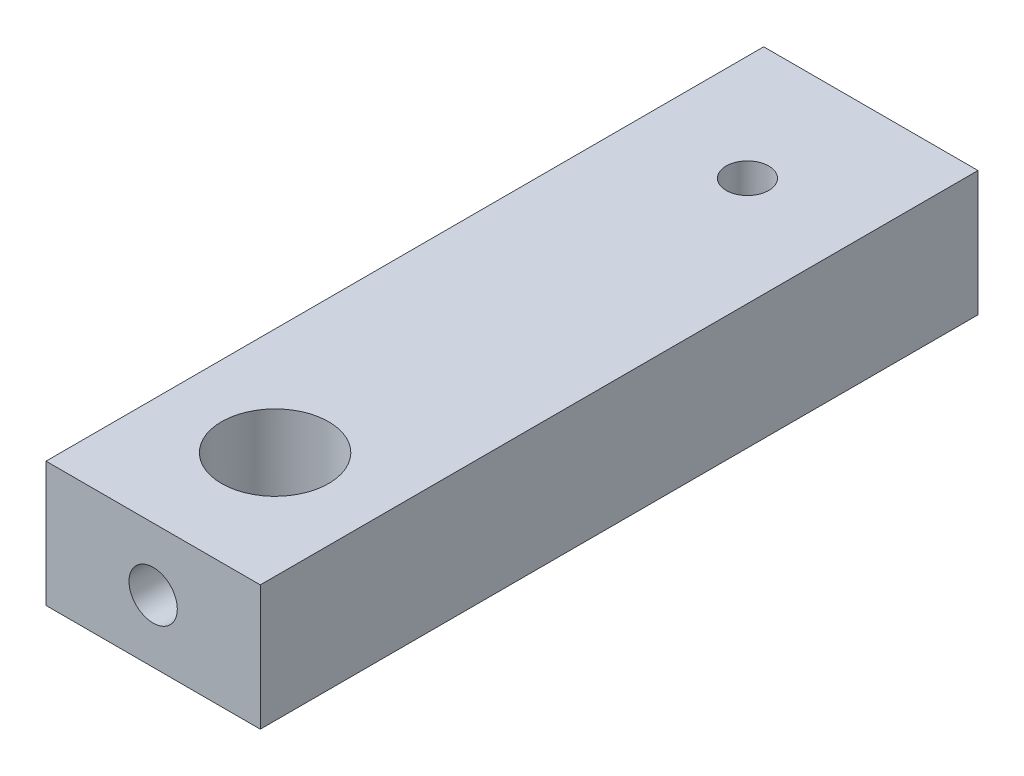
ISO-10303-21;
HEADER;
FILE_DESCRIPTION(('STEP AP214'),'2;1');
FILE_NAME('part.step','',(''),(''),'','','');
FILE_SCHEMA(('AUTOMOTIVE_DESIGN { 1 0 10303 214 1 1 1 1 }'));
ENDSEC;
DATA;
#1=APPLICATION_CONTEXT('core data for automotive mechanical design processes');
#2=APPLICATION_PROTOCOL_DEFINITION('international standard','automotive_design',2000,#1);
#3=PRODUCT_CONTEXT('',#1,'mechanical');
#4=PRODUCT('Part','Part','',(#3));
#5=PRODUCT_RELATED_PRODUCT_CATEGORY('part','',(#4));
#6=PRODUCT_DEFINITION_FORMATION('','',#4);
#7=PRODUCT_DEFINITION_CONTEXT('part definition',#1,'design');
#8=PRODUCT_DEFINITION('design','',#6,#7);
#9=PRODUCT_DEFINITION_SHAPE('','',#8);
#10=(LENGTH_UNIT() NAMED_UNIT(*) SI_UNIT(.MILLI.,.METRE.));
#11=(NAMED_UNIT(*) PLANE_ANGLE_UNIT() SI_UNIT($,.RADIAN.));
#12=(NAMED_UNIT(*) SI_UNIT($,.STERADIAN.) SOLID_ANGLE_UNIT());
#13=UNCERTAINTY_MEASURE_WITH_UNIT(LENGTH_MEASURE(1.E-05),#10,'distance_accuracy_value','');
#14=(GEOMETRIC_REPRESENTATION_CONTEXT(3) GLOBAL_UNCERTAINTY_ASSIGNED_CONTEXT((#13)) GLOBAL_UNIT_ASSIGNED_CONTEXT((#10,
#11,#12)) REPRESENTATION_CONTEXT('',''));
#15=CARTESIAN_POINT('',(0.,0.,0.));
#16=DIRECTION('',(0.,0.,1.));
#17=DIRECTION('',(1.,0.,0.));
#18=AXIS2_PLACEMENT_3D('',#15,#16,#17);
#19=CARTESIAN_POINT('',(-0.0811391500414985,7.,-13.2662510317848));
#20=DIRECTION('',(0.,1.,0.));
#21=DIRECTION('',(0.,0.,1.));
#22=AXIS2_PLACEMENT_3D('',#19,#20,#21);
#23=CYLINDRICAL_SURFACE('',#22,1.190625);
#24=CARTESIAN_POINT('',(-0.0811391500414985,2.14988595265788,-12.0756260317848));
#25=CARTESIAN_POINT('',(-0.0266104416284213,2.14661342305934,-12.0756306695591));
#26=CARTESIAN_POINT('',(0.0281860246765741,2.14666298661859,-12.0794039882261));
#27=CARTESIAN_POINT('',(0.136392825178123,2.15324815303669,-12.0943874098903));
#28=CARTESIAN_POINT('',(0.189800615234974,2.15979490301462,-12.1056102830103));
#29=CARTESIAN_POINT('',(0.293321052178596,2.17859664626291,-12.1347725583214));
#30=CARTESIAN_POINT('',(0.343450857278575,2.19081865043068,-12.1526730282977));
#31=CARTESIAN_POINT('',(0.439723511328243,2.21993359751358,-12.1943151788464));
#32=CARTESIAN_POINT('',(0.485865332776738,2.23682773952081,-12.2180583587626));
#33=CARTESIAN_POINT('',(0.58878545574092,2.28064112591013,-12.2795801909106));
#34=CARTESIAN_POINT('',(0.643740628190335,2.30900815266807,-12.3193749733096));
#35=CARTESIAN_POINT('',(0.745074920135262,2.3696221165848,-12.4063455569598));
#36=CARTESIAN_POINT('',(0.791434214846991,2.40187774640149,-12.453537968404));
#37=CARTESIAN_POINT('',(0.876218294231917,2.4682157015763,-12.5552494126774));
#38=CARTESIAN_POINT('',(0.914482226490973,2.50232066179624,-12.6098867914289));
#39=CARTESIAN_POINT('',(0.981799179655682,2.56851296239926,-12.725667696488));
#40=CARTESIAN_POINT('',(1.01086732563847,2.60060354555658,-12.7868003159027));
#41=CARTESIAN_POINT('',(1.04967569064313,2.64670660036699,-12.8912276800218));
#42=CARTESIAN_POINT('',(1.06255254303506,2.66293127344164,-12.9323673612682));
#43=CARTESIAN_POINT('',(1.08396844821668,2.69085681847759,-13.0172132536686));
#44=CARTESIAN_POINT('',(1.09251704744606,2.70256763250234,-13.0609135772256));
#45=CARTESIAN_POINT('',(1.10476775057976,2.71961559074502,-13.1509427508103));
#46=CARTESIAN_POINT('',(1.10839981884298,2.72486053731972,-13.1972999751399));
#47=CARTESIAN_POINT('',(1.11014897648341,2.72736452772686,-13.2903254757762));
#48=CARTESIAN_POINT('',(1.10826992323769,2.72462915719758,-13.3369935117221));
#49=CARTESIAN_POINT('',(1.09995853259931,2.71290558902697,-13.4215550061916));
#50=CARTESIAN_POINT('',(1.09428136820996,2.70495820029555,-13.4596825613097));
#51=CARTESIAN_POINT('',(1.07956037609286,2.68507966214942,-13.5342246426727));
#52=CARTESIAN_POINT('',(1.07051135124467,2.67314236594622,-13.5706364262593));
#53=CARTESIAN_POINT('',(1.04133682190559,2.63634896756332,-13.6686254090225));
#54=CARTESIAN_POINT('',(1.01803273830708,2.60859446161173,-13.7281537612817));
#55=CARTESIAN_POINT('',(0.963223667190271,2.54961587768627,-13.8414647791917));
#56=CARTESIAN_POINT('',(0.931695125705406,2.51838198476953,-13.8952303063858));
#57=CARTESIAN_POINT('',(0.858823458864664,2.45390590774927,-13.9999701796439));
#58=CARTESIAN_POINT('',(0.817034488937093,2.42064807062178,-14.0506264224558));
#59=CARTESIAN_POINT('',(0.724802835450631,2.35667253556977,-14.1451078975414));
#60=CARTESIAN_POINT('',(0.674376004445409,2.32595033454309,-14.1889453675681));
#61=CARTESIAN_POINT('',(0.57445624800666,2.27444620957605,-14.261695568636));
#62=CARTESIAN_POINT('',(0.526308074220934,2.25286398193471,-14.2918783093297));
#63=CARTESIAN_POINT('',(0.424602287201496,2.21467960196903,-14.3456564312488));
#64=CARTESIAN_POINT('',(0.371046872505226,2.19807543642094,-14.3692544751836));
#65=CARTESIAN_POINT('',(0.25904057791992,2.17122960000819,-14.4088005872769));
#66=CARTESIAN_POINT('',(0.200549880994763,2.16104669898213,-14.4246776972934));
#67=CARTESIAN_POINT('',(0.0810266345835215,2.14854799570644,-14.4473423702452));
#68=CARTESIAN_POINT('',(0.0199969088465023,2.14622367851302,-14.4541397664091));
#69=CARTESIAN_POINT('',(-0.0933160926993542,2.14965646562104,-14.4579656152868));
#70=CARTESIAN_POINT('',(-0.14559717680177,2.15430126891864,-14.4562564437615));
#71=CARTESIAN_POINT('',(-0.248628688924999,2.16947901349702,-14.4461721776121));
#72=CARTESIAN_POINT('',(-0.299379001575586,2.18001239742178,-14.4377965818535));
#73=CARTESIAN_POINT('',(-0.397293421296796,2.2061371775315,-14.4152172729169));
#74=CARTESIAN_POINT('',(-0.444500610784517,2.22164847234607,-14.4011049710506));
#75=CARTESIAN_POINT('',(-0.535383831012354,2.25696450990799,-14.3678835695749));
#76=CARTESIAN_POINT('',(-0.579058871106567,2.27677045146132,-14.3487730744639));
#77=CARTESIAN_POINT('',(-0.681788653151311,2.32984322743975,-14.2965389438051));
#78=CARTESIAN_POINT('',(-0.738606140635172,2.36509755463625,-14.2610232583977));
#79=CARTESIAN_POINT('',(-0.843532366031736,2.44072745047265,-14.1831138796367));
#80=CARTESIAN_POINT('',(-0.891613855144498,2.48111839683821,-14.1406994221194));
#81=CARTESIAN_POINT('',(-0.992758683802998,2.57799458770098,-14.0365301114337));
#82=CARTESIAN_POINT('',(-1.0427803495482,2.63559991340956,-13.9728461316889));
#83=CARTESIAN_POINT('',(-1.10730380248543,2.72245345552642,-13.8713731215793));
#84=CARTESIAN_POINT('',(-1.12705867983848,2.75147600605232,-13.8365613441132));
#85=CARTESIAN_POINT('',(-1.16314212146526,2.80888990366496,-13.764723852871));
#86=CARTESIAN_POINT('',(-1.17947377944472,2.83728179976879,-13.7277001773118));
#87=CARTESIAN_POINT('',(-1.20564321630408,2.88646470067064,-13.6588578861306));
#88=CARTESIAN_POINT('',(-1.21612560336846,2.90761527180064,-13.6275415432477));
#89=CARTESIAN_POINT('',(-1.23475662180634,2.94750816834532,-13.5627170370405));
#90=CARTESIAN_POINT('',(-1.24290743654654,2.96625273769503,-13.5292109606273));
#91=CARTESIAN_POINT('',(-1.2546432610844,2.99459909870191,-13.4690721038768));
#92=CARTESIAN_POINT('',(-1.25886754251686,3.00529630196317,-13.443095700807));
#93=CARTESIAN_POINT('',(-1.26565069811974,3.02291480366396,-13.3896963160522));
#94=CARTESIAN_POINT('',(-1.26821474149771,3.02984781106076,-13.3622781145529));
#95=CARTESIAN_POINT('',(-1.27115522571355,3.03786129557769,-13.3109619940639));
#96=CARTESIAN_POINT('',(-1.271816429022,3.03970171745522,-13.2872042204898));
#97=CARTESIAN_POINT('',(-1.27170535004096,3.03939493830284,-13.2397250275192));
#98=CARTESIAN_POINT('',(-1.27093336443087,3.03724856256581,-13.2160036016158));
#99=CARTESIAN_POINT('',(-1.26764843670844,3.0283163362411,-13.1629612325017));
#100=CARTESIAN_POINT('',(-1.26472171491368,3.02043430039618,-13.1338577070894));
#101=CARTESIAN_POINT('',(-1.25702355381803,3.00060358794841,-13.0772921631979));
#102=CARTESIAN_POINT('',(-1.25224408810329,2.98863724474084,-13.0498378956662));
#103=CARTESIAN_POINT('',(-1.23553326912909,2.94895205380677,-12.9696585405594));
#104=CARTESIAN_POINT('',(-1.22124705756,2.91750651193466,-12.9193315337415));
#105=CARTESIAN_POINT('',(-1.18734756440503,2.85113724131495,-12.8229715099073));
#106=CARTESIAN_POINT('',(-1.16771520091047,2.81620134286076,-12.7769546833768));
#107=CARTESIAN_POINT('',(-1.12739242481319,2.75197898070356,-12.696547830506));
#108=CARTESIAN_POINT('',(-1.1075825295875,2.72285434028782,-12.6615901950612));
#109=CARTESIAN_POINT('',(-1.06447190189321,2.6647730079244,-12.5937464640579));
#110=CARTESIAN_POINT('',(-1.04116919411372,2.63581642070437,-12.5608615557467));
#111=CARTESIAN_POINT('',(-0.965974703189447,2.55025009110379,-12.4655030244432));
#112=CARTESIAN_POINT('',(-0.908671866672462,2.4947338634709,-12.4060745177685));
#113=CARTESIAN_POINT('',(-0.800003796125982,2.40795932201913,-12.3154187448571));
#114=CARTESIAN_POINT('',(-0.752678577517001,2.37465001952376,-12.2812758958076));
#115=CARTESIAN_POINT('',(-0.651121329811186,2.31301093416615,-12.2192380560575));
#116=CARTESIAN_POINT('',(-0.596896910932597,2.28467574530608,-12.1913362732408));
#117=CARTESIAN_POINT('',(-0.492096164199862,2.23908209630067,-12.1476148324724));
#118=CARTESIAN_POINT('',(-0.442510743748418,2.22075547810304,-12.1305401769342));
#119=CARTESIAN_POINT('',(-0.33992236332236,2.18977265973172,-12.1028838855801));
#120=CARTESIAN_POINT('',(-0.286927959599415,2.17710285147325,-12.0922866446904));
#121=CARTESIAN_POINT('',(-0.207973281091732,2.16329283420443,-12.0821315323525));
#122=CARTESIAN_POINT('',(-0.182784074485146,2.15961525939556,-12.0797015095982));
#123=CARTESIAN_POINT('',(-0.132129236588335,2.15367753348708,-12.0764474412691));
#124=CARTESIAN_POINT('',(-0.10666352737486,2.1514177930909,-12.0756238608861));
#125=CARTESIAN_POINT('',(-0.0811391500414985,2.14988595265788,-12.0756260317848));
#126=B_SPLINE_CURVE_WITH_KNOTS('',3,(#24,#25,#26,#27,#28,#29,#30,#31,#32,#33,#34,#35,#36,#37,
#38,#39,#40,#41,#42,#43,#44,#45,#46,#47,#48,#49,#50,#51,#52,#53,#54,#55,#56,#57,#58,#59,#60,#61,
#62,#63,#64,#65,#66,#67,#68,#69,#70,#71,#72,#73,#74,#75,#76,#77,#78,#79,#80,#81,#82,#83,#84,#85,
#86,#87,#88,#89,#90,#91,#92,#93,#94,#95,#96,#97,#98,#99,#100,#101,#102,#103,#104,#105,#106,#107,
#108,#109,#110,#111,#112,#113,#114,#115,#116,#117,#118,#119,#120,#121,#122,#123,#124,#125),
.UNSPECIFIED.,.T.,.F.,(4,2,2,2,2,2,2,2,2,2,2,2,2,2,2,2,2,2,2,2,2,2,2,2,2,2,2,2,2,2,2,2,2,2,2,2,
2,2,2,2,2,2,2,2,2,2,2,2,2,2,4),(0.,0.16376990817401,0.327821280360281,0.490930768292587,
0.65408215676438,0.873526040501272,1.09346990087123,1.31744160233552,1.54104298012231,
1.67885493953169,1.81636160069281,1.95580711956032,2.09515506018464,2.21278825650757,
2.33060351845419,2.53851390179662,2.74702638319237,2.96705363521082,3.18668132784186,
3.36835211674825,3.54994933508832,3.73318535668708,3.91622277439855,4.07298247417762,
4.22975395915156,4.38411961419619,4.53852841440655,4.76440064467518,4.99096574008719,
5.28744957841934,5.4356622169461,5.58374032645565,5.70126462278171,5.81867850220655,
5.90367556497031,5.98840669750999,6.05955693891123,6.13069245339392,6.22103451261484,
6.31177240407585,6.49390095142835,6.6766882855765,6.82537851020936,6.97415314401073,
7.27066340080991,7.47159652946266,7.67230990815343,7.83831123575062,8.00391104828089,
8.08054801819107,8.1572071772604),.UNSPECIFIED.);
#127=CARTESIAN_POINT('',(-0.0811391500414985,2.14988595265788,-12.0756260317848));
#128=VERTEX_POINT('',#127);
#129=EDGE_CURVE('E34',#128,#128,#126,.T.);
#130=ORIENTED_EDGE('',*,*,#129,.T.);
#131=EDGE_LOOP('',(#130));
#132=FACE_BOUND('',#131,.T.);
#133=CARTESIAN_POINT('',(-0.0811391500414985,0.,-13.2662510317848));
#134=DIRECTION('',(0.,-1.,0.));
#135=DIRECTION('',(0.,0.,-1.));
#136=AXIS2_PLACEMENT_3D('',#133,#134,#135);
#137=CIRCLE('',#136,1.190625);
#138=CARTESIAN_POINT('',(-0.0811391500414985,0.,-14.4568760317848));
#139=VERTEX_POINT('',#138);
#140=EDGE_CURVE('E115',#139,#139,#137,.T.);
#141=ORIENTED_EDGE('',*,*,#140,.T.);
#142=EDGE_LOOP('',(#141));
#143=FACE_BOUND('',#142,.T.);
#144=ADVANCED_FACE('F30',(#132,#143),#23,.F.);
#145=CARTESIAN_POINT('',(6.,7.,20.095));
#146=DIRECTION('',(-1.,0.,0.));
#147=DIRECTION('',(0.,0.,1.));
#148=AXIS2_PLACEMENT_3D('',#145,#146,#147);
#149=PLANE('',#148);
#150=DIRECTION('',(0.,0.,-1.));
#151=VECTOR('',#150,1.);
#152=CARTESIAN_POINT('',(6.,0.,20.095));
#153=LINE('',#152,#151);
#154=CARTESIAN_POINT('',(6.,0.,20.095));
#155=VERTEX_POINT('',#154);
#156=CARTESIAN_POINT('',(6.,0.,-20.095));
#157=VERTEX_POINT('',#156);
#158=EDGE_CURVE('E123',#155,#157,#153,.T.);
#159=ORIENTED_EDGE('',*,*,#158,.T.);
#160=DIRECTION('',(0.,-1.,0.));
#161=VECTOR('',#160,1.);
#162=CARTESIAN_POINT('',(6.,7.,-20.095));
#163=LINE('',#162,#161);
#164=CARTESIAN_POINT('',(6.,7.,-20.095));
#165=VERTEX_POINT('',#164);
#166=EDGE_CURVE('E11',#165,#157,#163,.T.);
#167=ORIENTED_EDGE('',*,*,#166,.F.);
#168=DIRECTION('',(0.,0.,-1.));
#169=VECTOR('',#168,1.);
#170=CARTESIAN_POINT('',(6.,7.,20.095));
#171=LINE('',#170,#169);
#172=CARTESIAN_POINT('',(6.,7.,20.095));
#173=VERTEX_POINT('',#172);
#174=EDGE_CURVE('E116',#173,#165,#171,.T.);
#175=ORIENTED_EDGE('',*,*,#174,.F.);
#176=DIRECTION('',(0.,-1.,0.));
#177=VECTOR('',#176,1.);
#178=CARTESIAN_POINT('',(6.,7.,20.095));
#179=LINE('',#178,#177);
#180=EDGE_CURVE('E122',#173,#155,#179,.T.);
#181=ORIENTED_EDGE('',*,*,#180,.T.);
#182=EDGE_LOOP('',(#159,#167,#175,#181));
#183=FACE_BOUND('',#182,.T.);
#184=ADVANCED_FACE('F32',(#183),#149,.F.);
#185=CARTESIAN_POINT('',(-6.,7.,-20.095));
#186=DIRECTION('',(0.,0.,1.));
#187=DIRECTION('',(1.,0.,0.));
#188=AXIS2_PLACEMENT_3D('',#185,#186,#187);
#189=PLANE('',#188);
#190=CARTESIAN_POINT('',(0.,3.5,-20.095));
#191=DIRECTION('',(0.,0.,-1.));
#192=DIRECTION('',(-1.,0.,0.));
#193=AXIS2_PLACEMENT_3D('',#190,#191,#192);
#194=CIRCLE('',#193,1.35254999999999);
#195=CARTESIAN_POINT('',(-1.35254999999999,3.5,-20.095));
#196=VERTEX_POINT('',#195);
#197=EDGE_CURVE('E98',#196,#196,#194,.T.);
#198=ORIENTED_EDGE('',*,*,#197,.F.);
#199=EDGE_LOOP('',(#198));
#200=FACE_BOUND('',#199,.T.);
#201=DIRECTION('',(-1.,0.,0.));
#202=VECTOR('',#201,1.);
#203=CARTESIAN_POINT('',(-6.,0.,-20.095));
#204=LINE('',#203,#202);
#205=CARTESIAN_POINT('',(-6.,0.,-20.095));
#206=VERTEX_POINT('',#205);
#207=EDGE_CURVE('E126',#157,#206,#204,.T.);
#208=ORIENTED_EDGE('',*,*,#207,.T.);
#209=DIRECTION('',(0.,-1.,0.));
#210=VECTOR('',#209,1.);
#211=CARTESIAN_POINT('',(-6.,7.,-20.095));
#212=LINE('',#211,#210);
#213=CARTESIAN_POINT('',(-6.,7.,-20.095));
#214=VERTEX_POINT('',#213);
#215=EDGE_CURVE('E44',#214,#206,#212,.T.);
#216=ORIENTED_EDGE('',*,*,#215,.F.);
#217=DIRECTION('',(-1.,0.,0.));
#218=VECTOR('',#217,1.);
#219=CARTESIAN_POINT('',(-6.,7.,-20.095));
#220=LINE('',#219,#218);
#221=EDGE_CURVE('E84',#165,#214,#220,.T.);
#222=ORIENTED_EDGE('',*,*,#221,.F.);
#223=ORIENTED_EDGE('',*,*,#166,.T.);
#224=EDGE_LOOP('',(#208,#216,#222,#223));
#225=FACE_BOUND('',#224,.T.);
#226=ADVANCED_FACE('F164',(#200,#225),#189,.F.);
#227=CARTESIAN_POINT('',(-6.,7.,20.095));
#228=DIRECTION('',(1.,0.,0.));
#229=DIRECTION('',(0.,0.,-1.));
#230=AXIS2_PLACEMENT_3D('',#227,#228,#229);
#231=PLANE('',#230);
#232=DIRECTION('',(0.,0.,1.));
#233=VECTOR('',#232,1.);
#234=CARTESIAN_POINT('',(-6.,0.,20.095));
#235=LINE('',#234,#233);
#236=CARTESIAN_POINT('',(-6.,0.,20.095));
#237=VERTEX_POINT('',#236);
#238=EDGE_CURVE('E71',#206,#237,#235,.T.);
#239=ORIENTED_EDGE('',*,*,#238,.T.);
#240=DIRECTION('',(0.,-1.,0.));
#241=VECTOR('',#240,1.);
#242=CARTESIAN_POINT('',(-6.,7.,20.095));
#243=LINE('',#242,#241);
#244=CARTESIAN_POINT('',(-6.,7.,20.095));
#245=VERTEX_POINT('',#244);
#246=EDGE_CURVE('E131',#245,#237,#243,.T.);
#247=ORIENTED_EDGE('',*,*,#246,.F.);
#248=DIRECTION('',(0.,0.,1.));
#249=VECTOR('',#248,1.);
#250=CARTESIAN_POINT('',(-6.,7.,20.095));
#251=LINE('',#250,#249);
#252=EDGE_CURVE('E119',#214,#245,#251,.T.);
#253=ORIENTED_EDGE('',*,*,#252,.F.);
#254=ORIENTED_EDGE('',*,*,#215,.T.);
#255=EDGE_LOOP('',(#239,#247,#253,#254));
#256=FACE_BOUND('',#255,.T.);
#257=ADVANCED_FACE('F192',(#256),#231,.F.);
#258=CARTESIAN_POINT('',(-6.,7.,20.095));
#259=DIRECTION('',(0.,0.,-1.));
#260=DIRECTION('',(-1.,0.,0.));
#261=AXIS2_PLACEMENT_3D('',#258,#259,#260);
#262=PLANE('',#261);
#263=CARTESIAN_POINT('',(0.,3.5,20.095));
#264=DIRECTION('',(0.,0.,1.));
#265=DIRECTION('',(1.,0.,0.));
#266=AXIS2_PLACEMENT_3D('',#263,#264,#265);
#267=CIRCLE('',#266,1.35254999999999);
#268=CARTESIAN_POINT('',(1.35254999999999,3.5,20.095));
#269=VERTEX_POINT('',#268);
#270=EDGE_CURVE('E104',#269,#269,#267,.T.);
#271=ORIENTED_EDGE('',*,*,#270,.F.);
#272=EDGE_LOOP('',(#271));
#273=FACE_BOUND('',#272,.T.);
#274=DIRECTION('',(1.,0.,0.));
#275=VECTOR('',#274,1.);
#276=CARTESIAN_POINT('',(-6.,0.,20.095));
#277=LINE('',#276,#275);
#278=EDGE_CURVE('E77',#237,#155,#277,.T.);
#279=ORIENTED_EDGE('',*,*,#278,.T.);
#280=ORIENTED_EDGE('',*,*,#180,.F.);
#281=DIRECTION('',(1.,0.,0.));
#282=VECTOR('',#281,1.);
#283=CARTESIAN_POINT('',(-6.,7.,20.095));
#284=LINE('',#283,#282);
#285=EDGE_CURVE('E53',#245,#173,#284,.T.);
#286=ORIENTED_EDGE('',*,*,#285,.F.);
#287=ORIENTED_EDGE('',*,*,#246,.T.);
#288=EDGE_LOOP('',(#279,#280,#286,#287));
#289=FACE_BOUND('',#288,.T.);
#290=ADVANCED_FACE('F185',(#273,#289),#262,.F.);
#291=CARTESIAN_POINT('',(6.,7.,-20.095));
#292=DIRECTION('',(0.,-1.,0.));
#293=DIRECTION('',(0.,0.,-1.));
#294=AXIS2_PLACEMENT_3D('',#291,#292,#293);
#295=PLANE('',#294);
#296=CARTESIAN_POINT('',(0.,7.,13.2664991614216));
#297=DIRECTION('',(0.,1.,0.));
#298=DIRECTION('',(0.,0.,1.));
#299=AXIS2_PLACEMENT_3D('',#296,#297,#298);
#300=CIRCLE('',#299,3.);
#301=CARTESIAN_POINT('',(0.,7.,16.2664991614216));
#302=VERTEX_POINT('',#301);
#303=EDGE_CURVE('E108',#302,#302,#300,.T.);
#304=ORIENTED_EDGE('',*,*,#303,.F.);
#305=EDGE_LOOP('',(#304));
#306=FACE_BOUND('',#305,.T.);
#307=CARTESIAN_POINT('',(-0.0811391500414985,7.,-13.2662510317848));
#308=DIRECTION('',(0.,1.,0.));
#309=DIRECTION('',(0.,0.,1.));
#310=AXIS2_PLACEMENT_3D('',#307,#308,#309);
#311=CIRCLE('',#310,1.190625);
#312=CARTESIAN_POINT('',(-0.0811391500414985,7.,-12.0756260317848));
#313=VERTEX_POINT('',#312);
#314=EDGE_CURVE('E112',#313,#313,#311,.T.);
#315=ORIENTED_EDGE('',*,*,#314,.F.);
#316=EDGE_LOOP('',(#315));
#317=FACE_BOUND('',#316,.T.);
#318=ORIENTED_EDGE('',*,*,#174,.T.);
#319=ORIENTED_EDGE('',*,*,#221,.T.);
#320=ORIENTED_EDGE('',*,*,#252,.T.);
#321=ORIENTED_EDGE('',*,*,#285,.T.);
#322=EDGE_LOOP('',(#318,#319,#320,#321));
#323=FACE_BOUND('',#322,.T.);
#324=ADVANCED_FACE('F178',(#306,#317,#323),#295,.F.);
#325=CARTESIAN_POINT('',(6.,0.,-20.095));
#326=DIRECTION('',(0.,-1.,0.));
#327=DIRECTION('',(0.,0.,-1.));
#328=AXIS2_PLACEMENT_3D('',#325,#326,#327);
#329=PLANE('',#328);
#330=CARTESIAN_POINT('',(0.,0.,13.2664991614216));
#331=DIRECTION('',(0.,-1.,0.));
#332=DIRECTION('',(0.,0.,-1.));
#333=AXIS2_PLACEMENT_3D('',#330,#331,#332);
#334=CIRCLE('',#333,3.);
#335=CARTESIAN_POINT('',(0.,0.,10.2664991614216));
#336=VERTEX_POINT('',#335);
#337=EDGE_CURVE('E111',#336,#336,#334,.T.);
#338=ORIENTED_EDGE('',*,*,#337,.F.);
#339=EDGE_LOOP('',(#338));
#340=FACE_BOUND('',#339,.T.);
#341=ORIENTED_EDGE('',*,*,#140,.F.);
#342=EDGE_LOOP('',(#341));
#343=FACE_BOUND('',#342,.T.);
#344=ORIENTED_EDGE('',*,*,#158,.F.);
#345=ORIENTED_EDGE('',*,*,#278,.F.);
#346=ORIENTED_EDGE('',*,*,#238,.F.);
#347=ORIENTED_EDGE('',*,*,#207,.F.);
#348=EDGE_LOOP('',(#344,#345,#346,#347));
#349=FACE_BOUND('',#348,.T.);
#350=ADVANCED_FACE('F171',(#340,#343,#349),#329,.T.);
#351=CARTESIAN_POINT('',(-0.0811391500414985,4.85011404734212,-12.0756260317848));
#352=CARTESIAN_POINT('',(-0.137704021136016,4.84670996906345,-12.0756306365966));
#353=CARTESIAN_POINT('',(-0.194097052773511,4.83972384949971,-12.0796904421288));
#354=CARTESIAN_POINT('',(-0.304553263821695,4.81901907003298,-12.0954390440179));
#355=CARTESIAN_POINT('',(-0.358612820505599,4.80529032418039,-12.1071392779699));
#356=CARTESIAN_POINT('',(-0.462541218921291,4.77216426993899,-12.1370807991117));
#357=CARTESIAN_POINT('',(-0.512437596472338,4.75280877101674,-12.155274059227));
#358=CARTESIAN_POINT('',(-0.607678885751689,4.70948793731253,-12.1971138831466));
#359=CARTESIAN_POINT('',(-0.65302279371922,4.68552158928004,-12.2207616458248));
#360=CARTESIAN_POINT('',(-0.757625750073238,4.6227489199431,-12.2838340970408));
#361=CARTESIAN_POINT('',(-0.814306060487493,4.58203444855137,-12.3256372415292));
#362=CARTESIAN_POINT('',(-0.917686942570842,4.49588911912705,-12.4162371645063));
#363=CARTESIAN_POINT('',(-0.964360283910055,4.45044587969724,-12.4650524367198));
#364=CARTESIAN_POINT('',(-1.04917424257862,4.3559998777719,-12.5697161791213));
#365=CARTESIAN_POINT('',(-1.08705936531714,4.30693506069813,-12.6257153690707));
#366=CARTESIAN_POINT('',(-1.13651454358762,4.23389005077797,-12.7140721675916));
#367=CARTESIAN_POINT('',(-1.15176174292341,4.20965261154842,-12.7442253249956));
#368=CARTESIAN_POINT('',(-1.17982473398029,4.16194153997488,-12.8062107563018));
#369=CARTESIAN_POINT('',(-1.19264218692401,4.13846739492835,-12.8380418638174));
#370=CARTESIAN_POINT('',(-1.21383178774134,4.09703532719816,-12.8982367036402));
#371=CARTESIAN_POINT('',(-1.22258903451855,4.07881405520167,-12.9262819927661));
#372=CARTESIAN_POINT('',(-1.23825956539194,4.04448028612727,-12.984186197485));
#373=CARTESIAN_POINT('',(-1.24517238638766,4.02836831917223,-13.0140455662531));
#374=CARTESIAN_POINT('',(-1.25588996763667,4.00229140291371,-13.0707184912743));
#375=CARTESIAN_POINT('',(-1.26002246823618,3.9917478587364,-13.0971947501539));
#376=CARTESIAN_POINT('',(-1.26654499740305,3.97470070956964,-13.1516026304479));
#377=CARTESIAN_POINT('',(-1.2689412348248,3.96818272171694,-13.1795286795027));
#378=CARTESIAN_POINT('',(-1.27149450814141,3.96120006423156,-13.2315612341255));
#379=CARTESIAN_POINT('',(-1.27195569384986,3.9599142672035,-13.2555379788596));
#380=CARTESIAN_POINT('',(-1.27142641964213,3.96137473990868,-13.303349545276));
#381=CARTESIAN_POINT('',(-1.2704356293252,3.96412192735782,-13.3271843334165));
#382=CARTESIAN_POINT('',(-1.2665952409584,3.97451632156259,-13.3812565419783));
#383=CARTESIAN_POINT('',(-1.26326797545671,3.98340992821505,-13.411210565673));
#384=CARTESIAN_POINT('',(-1.25468657148701,4.00526134681935,-13.4693447258767));
#385=CARTESIAN_POINT('',(-1.24942380405312,4.01823732097816,-13.4975162459403));
#386=CARTESIAN_POINT('',(-1.23706770127253,4.04709186330736,-13.5530449634546));
#387=CARTESIAN_POINT('',(-1.2299216589637,4.06304935767768,-13.5803480958431));
#388=CARTESIAN_POINT('',(-1.21404420413831,4.09651818044341,-13.6335154173383));
#389=CARTESIAN_POINT('',(-1.20531107424646,4.11403118144149,-13.6593780076466));
#390=CARTESIAN_POINT('',(-1.17681827379747,4.16793201507842,-13.7353063846125));
#391=CARTESIAN_POINT('',(-1.15478972025631,4.20562022435211,-13.7836081153473));
#392=CARTESIAN_POINT('',(-1.11107236800994,4.27206550877823,-13.8648992078056));
#393=CARTESIAN_POINT('',(-1.0906720669169,4.3007029620833,-13.8987005730187));
#394=CARTESIAN_POINT('',(-1.04647376826056,4.35766180257414,-13.9643088322604));
#395=CARTESIAN_POINT('',(-1.02267409145479,4.38598302604744,-13.9961147293137));
#396=CARTESIAN_POINT('',(-0.946135948849386,4.46948363312498,-14.0882818589873));
#397=CARTESIAN_POINT('',(-0.888127099385254,4.52340996401761,-14.1456397921524));
#398=CARTESIAN_POINT('',(-0.778722721063326,4.60728834099337,-14.2327628606549));
#399=CARTESIAN_POINT('',(-0.731251968865501,4.63935487470383,-14.2654536502506));
#400=CARTESIAN_POINT('',(-0.629711165610412,4.6984529437222,-14.3245970174346));
#401=CARTESIAN_POINT('',(-0.575650214514883,4.72549129460716,-14.351058052443));
#402=CARTESIAN_POINT('',(-0.471082889454159,4.76890655490751,-14.3923703485767));
#403=CARTESIAN_POINT('',(-0.421480278194755,4.78630867418578,-14.408420477186));
#404=CARTESIAN_POINT('',(-0.319028781726149,4.8154623285138,-14.4340601054302));
#405=CARTESIAN_POINT('',(-0.266181891810084,4.82721729817162,-14.4436535334712));
#406=CARTESIAN_POINT('',(-0.158370213217935,4.8443593091442,-14.4556108884532));
#407=CARTESIAN_POINT('',(-0.103396304658912,4.84971482065791,-14.4579391099892));
#408=CARTESIAN_POINT('',(0.00658232327597119,4.85365216578918,-14.4549129248976));
#409=CARTESIAN_POINT('',(0.061587038393942,4.85223477637792,-14.4495593995511));
#410=CARTESIAN_POINT('',(0.165390656664685,4.84332923035001,-14.432165941113));
#411=CARTESIAN_POINT('',(0.214332220643074,4.83634005153838,-14.420700269531));
#412=CARTESIAN_POINT('',(0.309523588736814,4.81755163833192,-14.3920586977421));
#413=CARTESIAN_POINT('',(0.355773017643283,4.80575173528128,-14.3748820038056));
#414=CARTESIAN_POINT('',(0.448170243517254,4.77712531569046,-14.3340348399237));
#415=CARTESIAN_POINT('',(0.494045080646173,4.7599857968543,-14.3099710935851));
#416=CARTESIAN_POINT('',(0.581269711974506,4.72220358253648,-14.2569141458589));
#417=CARTESIAN_POINT('',(0.622615740659322,4.70155800774573,-14.2279168928478));
#418=CARTESIAN_POINT('',(0.719177835601429,4.64740089410579,-14.1508486173305));
#419=CARTESIAN_POINT('',(0.771599593314479,4.61245053090253,-14.1002780956023));
#420=CARTESIAN_POINT('',(0.866047201433369,4.5406121645005,-13.9912689613506));
#421=CARTESIAN_POINT('',(0.908052125324704,4.50372043853704,-13.9328148691334));
#422=CARTESIAN_POINT('',(0.972900258101607,4.44043059821076,-13.8227323644561));
#423=CARTESIAN_POINT('',(0.997928414910537,4.41357659192288,-13.7726450113234));
#424=CARTESIAN_POINT('',(1.0411736773603,4.36395785503517,-13.6677535197872));
#425=CARTESIAN_POINT('',(1.059410989057,4.34118109938194,-13.6129639811365));
#426=CARTESIAN_POINT('',(1.08344083822581,4.30981980606053,-13.5171095361381));
#427=CARTESIAN_POINT('',(1.09135004824876,4.29902722304044,-13.4773177557591));
#428=CARTESIAN_POINT('',(1.1030900514851,4.28274350780218,-13.3961094895134));
#429=CARTESIAN_POINT('',(1.1069303367518,4.27724003985388,-13.3546970196967));
#430=CARTESIAN_POINT('',(1.11021422188413,4.27254576780632,-13.2710704997465));
#431=CARTESIAN_POINT('',(1.10963168470323,4.27339249034026,-13.2288531574329));
#432=CARTESIAN_POINT('',(1.10406804014329,4.28130990146779,-13.1452822176415));
#433=CARTESIAN_POINT('',(1.09907999758408,4.28839040326854,-13.1039300872998));
#434=CARTESIAN_POINT('',(1.08307477019504,4.31028897469132,-13.0112810016517));
#435=CARTESIAN_POINT('',(1.07071845908488,4.32676722880251,-12.960623963683));
#436=CARTESIAN_POINT('',(1.04029289380373,4.364740110862,-12.8630016575534));
#437=CARTESIAN_POINT('',(1.02220369177533,4.386252184781,-12.8160500058929));
#438=CARTESIAN_POINT('',(0.970657538516746,4.44303583622111,-12.7033689152041));
#439=CARTESIAN_POINT('',(0.93402759841371,4.47984222398915,-12.6398677071911));
#440=CARTESIAN_POINT('',(0.849974237555269,4.55360397645817,-12.5206484964657));
#441=CARTESIAN_POINT('',(0.802553291114456,4.59055930510274,-12.4649287142369));
#442=CARTESIAN_POINT('',(0.705884705069172,4.65494606752307,-12.3707478525156));
#443=CARTESIAN_POINT('',(0.658303977695892,4.68293092371097,-12.3309618034272));
#444=CARTESIAN_POINT('',(0.5558847092774,4.73436340705166,-12.2584267168143));
#445=CARTESIAN_POINT('',(0.501058317745936,4.75781847116698,-12.2256661350197));
#446=CARTESIAN_POINT('',(0.395954754217872,4.79425307837203,-12.1741370441801));
#447=CARTESIAN_POINT('',(0.346801303285071,4.80837708245052,-12.1538918718296));
#448=CARTESIAN_POINT('',(0.245104679768866,4.83117086414892,-12.1199473856821));
#449=CARTESIAN_POINT('',(0.192567256134807,4.83984963641476,-12.106237286049));
#450=CARTESIAN_POINT('',(0.102906193221072,4.84912078957668,-12.0893601396563));
#451=CARTESIAN_POINT('',(0.0663170516313177,4.85142386099761,-12.0842151919033));
#452=CARTESIAN_POINT('',(-0.00725212569392678,4.85303123102406,-12.0773463960374));
#453=CARTESIAN_POINT('',(-0.0442322154707517,4.85233510949384,-12.0756230272789));
#454=CARTESIAN_POINT('',(-0.0811391500414985,4.85011404734212,-12.0756260317848));
#455=B_SPLINE_CURVE_WITH_KNOTS('',3,(#351,#352,#353,#354,#355,#356,#357,#358,#359,#360,#361,
#362,#363,#364,#365,#366,#367,#368,#369,#370,#371,#372,#373,#374,#375,#376,#377,#378,#379,#380,
#381,#382,#383,#384,#385,#386,#387,#388,#389,#390,#391,#392,#393,#394,#395,#396,#397,#398,#399,
#400,#401,#402,#403,#404,#405,#406,#407,#408,#409,#410,#411,#412,#413,#414,#415,#416,#417,#418,
#419,#420,#421,#422,#423,#424,#425,#426,#427,#428,#429,#430,#431,#432,#433,#434,#435,#436,#437,
#438,#439,#440,#441,#442,#443,#444,#445,#446,#447,#448,#449,#450,#451,#452,#453,#454),
.UNSPECIFIED.,.T.,.F.,(4,2,2,2,2,2,2,2,2,2,2,2,2,2,2,2,2,2,2,2,2,2,2,2,2,2,2,2,2,2,2,2,2,2,2,2,
2,2,2,2,2,2,2,2,2,2,2,2,2,2,2,4),(0.,0.169837962919994,0.339930755103139,0.508790642078188,
0.67768767908892,0.920395174820685,1.16375495637773,1.41348852021907,1.53815919095451,
1.66274431421801,1.76635506146797,1.86999179898975,1.95612531278154,2.04194927334884,
2.11361707200315,2.18530118137552,2.2790149316505,2.3731516493891,2.47027039210547,
2.5674948588847,2.76231221056306,2.90848637224896,3.05473299320508,3.34618803409123,
3.54341933362296,3.74038131071873,3.90459129671934,4.06870128302804,4.23361654015295,
4.39851287904405,4.55010637215506,4.70172094285042,4.86481773844865,5.02804912898381,
5.26916037309055,5.51075213484239,5.69655269357612,5.88179590207712,6.00729075959891,
6.13249221174377,6.25843412595255,6.3845746529574,6.54770710210125,6.71141352802494,
6.9562662301578,7.20106284547008,7.4044366065567,7.60747357817271,7.77182350934841,
7.93590124118377,8.04670005484046,8.15751439002463),.UNSPECIFIED.);
#456=CARTESIAN_POINT('',(-0.0811391500414985,4.85011404734212,-12.0756260317848));
#457=VERTEX_POINT('',#456);
#458=EDGE_CURVE('E97',#457,#457,#455,.T.);
#459=ORIENTED_EDGE('',*,*,#458,.T.);
#460=EDGE_LOOP('',(#459));
#461=FACE_BOUND('',#460,.T.);
#462=ORIENTED_EDGE('',*,*,#314,.T.);
#463=EDGE_LOOP('',(#462));
#464=FACE_BOUND('',#463,.T.);
#465=ADVANCED_FACE('F160',(#461,#464),#23,.F.);
#466=CARTESIAN_POINT('',(0.,7.,13.2664991614216));
#467=DIRECTION('',(0.,1.,0.));
#468=DIRECTION('',(0.,0.,1.));
#469=AXIS2_PLACEMENT_3D('',#466,#467,#468);
#470=CYLINDRICAL_SURFACE('',#469,3.);
#471=CARTESIAN_POINT('',(0.,2.14745000000001,16.2664991614216));
#472=CARTESIAN_POINT('',(0.0719164112466011,2.14745353797719,16.2664962432099));
#473=CARTESIAN_POINT('',(0.143942352405148,2.15321958434716,16.2638843955707));
#474=CARTESIAN_POINT('',(0.28591601388326,2.17605244746633,16.2536959418431));
#475=CARTESIAN_POINT('',(0.355858443955692,2.19314582959874,16.2461076652418));
#476=CARTESIAN_POINT('',(0.49138722004871,2.23785808810903,16.226770693709));
#477=CARTESIAN_POINT('',(0.55698829003476,2.26543899344296,16.2150370183143));
#478=CARTESIAN_POINT('',(0.682557635758803,2.33017087475925,16.1885256637313));
#479=CARTESIAN_POINT('',(0.742527093878145,2.36731983572911,16.1737486256));
#480=CARTESIAN_POINT('',(0.858640089296845,2.45234924402896,16.1416603556157));
#481=CARTESIAN_POINT('',(0.914423267546415,2.50068676810275,16.1242573768797));
#482=CARTESIAN_POINT('',(1.01741065823772,2.60574947579555,16.0892354394301));
#483=CARTESIAN_POINT('',(1.0646096079309,2.66247976639808,16.0716163552457));
#484=CARTESIAN_POINT('',(1.15189700070084,2.78681601093685,16.0369632120603));
#485=CARTESIAN_POINT('',(1.19139101342882,2.85486959972534,16.0200272363015));
#486=CARTESIAN_POINT('',(1.25821181269332,2.99751896123215,15.9901460866591));
#487=CARTESIAN_POINT('',(1.28554589526806,3.07211077871902,15.9771985211414));
#488=CARTESIAN_POINT('',(1.32572107436126,3.22158244146548,15.957770334493));
#489=CARTESIAN_POINT('',(1.339260210991,3.29623273121834,15.9509803946461));
#490=CARTESIAN_POINT('',(1.3536289472601,3.44703004153053,15.9437665208907));
#491=CARTESIAN_POINT('',(1.35446742051683,3.52317597987186,15.9433381423318));
#492=CARTESIAN_POINT('',(1.34393052508184,3.66725031712377,15.948638705854));
#493=CARTESIAN_POINT('',(1.33367977603728,3.73528633258468,15.9538007462304));
#494=CARTESIAN_POINT('',(1.30316610446025,3.86854295902827,15.9687285222462));
#495=CARTESIAN_POINT('',(1.28290084469335,3.93376290891852,15.9784953325444));
#496=CARTESIAN_POINT('',(1.23253226130336,4.06130733895853,16.0017588527031));
#497=CARTESIAN_POINT('',(1.20221644805386,4.12353274199048,16.0153350541019));
#498=CARTESIAN_POINT('',(1.13276093939223,4.24228079352612,16.0446769830594));
#499=CARTESIAN_POINT('',(1.09361748337977,4.29880099670063,16.0604436426571));
#500=CARTESIAN_POINT('',(1.0030093454427,4.41051730602752,16.094313881399));
#501=CARTESIAN_POINT('',(0.950701498876136,4.46500878779422,16.1124930288154));
#502=CARTESIAN_POINT('',(0.837544990316959,4.5647056021425,16.1478235577509));
#503=CARTESIAN_POINT('',(0.776693607281956,4.60990796487578,16.1649746093373));
#504=CARTESIAN_POINT('',(0.645722400825652,4.69102750239168,16.1969804430025));
#505=CARTESIAN_POINT('',(0.57537261364043,4.72661092531452,16.2117468714345));
#506=CARTESIAN_POINT('',(0.428848625555504,4.78518240328856,16.2366161674284));
#507=CARTESIAN_POINT('',(0.352678240578195,4.80817863099638,16.2467220603257));
#508=CARTESIAN_POINT('',(0.202521210242974,4.83933938553743,16.260536413076));
#509=CARTESIAN_POINT('',(0.128767622893638,4.84844654252247,16.2646505079908));
#510=CARTESIAN_POINT('',(-0.0193246230159013,4.85443862767125,16.2673495847127));
#511=CARTESIAN_POINT('',(-0.0936630657976884,4.85132787025741,16.2659365182866));
#512=CARTESIAN_POINT('',(-0.236086108502687,4.83360241122162,16.2579952748486));
#513=CARTESIAN_POINT('',(-0.304277862108437,4.81969117741616,16.2517799958282));
#514=CARTESIAN_POINT('',(-0.437260479561711,4.78178665226837,16.2352187375719));
#515=CARTESIAN_POINT('',(-0.502050933308647,4.75779214829516,16.2248722615188));
#516=CARTESIAN_POINT('',(-0.628684591777726,4.69964714056021,16.2006163051241));
#517=CARTESIAN_POINT('',(-0.690373459820878,4.66520397894863,16.186606017853));
#518=CARTESIAN_POINT('',(-0.807317727760678,4.58745825067924,16.1564629682303));
#519=CARTESIAN_POINT('',(-0.862570295354581,4.54415180665892,16.1403292780739));
#520=CARTESIAN_POINT('',(-0.969893863682818,4.44574125671956,16.1059951471114));
#521=CARTESIAN_POINT('',(-1.02132398110512,4.38995771486566,16.0877341231232));
#522=CARTESIAN_POINT('',(-1.11431694893604,4.27034461590095,16.0523167078425));
#523=CARTESIAN_POINT('',(-1.15587596986747,4.20651195079865,16.0351607471327));
#524=CARTESIAN_POINT('',(-1.22888099330634,4.07039991376359,16.0035560172436));
#525=CARTESIAN_POINT('',(-1.26003693151308,3.99794448324691,15.9891889486218));
#526=CARTESIAN_POINT('',(-1.30940263753641,3.84795523824507,15.9657998088527));
#527=CARTESIAN_POINT('',(-1.3276255512683,3.77042666823705,15.9567723117989));
#528=CARTESIAN_POINT('',(-1.34920330252629,3.61970169821159,15.946010788031));
#529=CARTESIAN_POINT('',(-1.35370676561996,3.54670979055421,15.9437139674454));
#530=CARTESIAN_POINT('',(-1.35088824594487,3.40102324985628,15.9451377722481));
#531=CARTESIAN_POINT('',(-1.34356898996138,3.32832855214393,15.9488570100964));
#532=CARTESIAN_POINT('',(-1.31832720728868,3.1901166504239,15.9613441852636));
#533=CARTESIAN_POINT('',(-1.30110934122115,3.12443712837458,15.9697756524767));
#534=CARTESIAN_POINT('',(-1.25731619001767,2.9969134461877,15.9904188894158));
#535=CARTESIAN_POINT('',(-1.23073817910714,2.93507040945258,16.0026317602016));
#536=CARTESIAN_POINT('',(-1.16701242057292,2.81258099050288,16.0304389514024));
#537=CARTESIAN_POINT('',(-1.12929130989187,2.75227189268145,16.046201119095));
#538=CARTESIAN_POINT('',(-1.0450817296113,2.6384835955802,16.0789436506712));
#539=CARTESIAN_POINT('',(-0.998589466196651,2.58500736859471,16.0959245397158));
#540=CARTESIAN_POINT('',(-0.893155801393095,2.48136730109378,16.1310462491912));
#541=CARTESIAN_POINT('',(-0.833466200394423,2.43194880697097,16.1491518443573));
#542=CARTESIAN_POINT('',(-0.706017577114338,2.34374102898893,16.1829834571759));
#543=CARTESIAN_POINT('',(-0.638254859368924,2.30495663990954,16.1987083775397));
#544=CARTESIAN_POINT('',(-0.497055684336301,2.2397151677381,16.2259001216574));
#545=CARTESIAN_POINT('',(-0.423681067030401,2.21314144915309,16.2374070118074));
#546=CARTESIAN_POINT('',(-0.27296674744071,2.17300162926952,16.2550109172593));
#547=CARTESIAN_POINT('',(-0.195639816780901,2.15939611490219,16.2611243202486));
#548=CARTESIAN_POINT('',(-0.0981701819605213,2.15087317821377,16.2649574252311));
#549=CARTESIAN_POINT('',(-0.078564979061189,2.14959073625619,16.2655345401961));
#550=CARTESIAN_POINT('',(-0.0393092459961239,2.14787865761492,16.2663058098273));
#551=CARTESIAN_POINT('',(-0.0196587151993751,2.14744903287603,16.2664999591295));
#552=CARTESIAN_POINT('',(0.,2.14745000000001,16.2664991614216));
#553=B_SPLINE_CURVE_WITH_KNOTS('',3,(#471,#472,#473,#474,#475,#476,#477,#478,#479,#480,#481,
#482,#483,#484,#485,#486,#487,#488,#489,#490,#491,#492,#493,#494,#495,#496,#497,#498,#499,#500,
#501,#502,#503,#504,#505,#506,#507,#508,#509,#510,#511,#512,#513,#514,#515,#516,#517,#518,#519,
#520,#521,#522,#523,#524,#525,#526,#527,#528,#529,#530,#531,#532,#533,#534,#535,#536,#537,#538,
#539,#540,#541,#542,#543,#544,#545,#546,#547,#548,#549,#550,#551,#552),.UNSPECIFIED.,.T.,.F.,(4,
2,2,2,2,2,2,2,2,2,2,2,2,2,2,2,2,2,2,2,2,2,2,2,2,2,2,2,2,2,2,2,2,2,2,2,2,2,2,2,4),(0.,
0.215668561286783,0.431844716860144,0.647245526463399,0.862601010145807,1.08913900127064,
1.31581541170339,1.55605483141223,1.79614991082782,2.02338117236713,2.25045366610905,
2.45648403928473,2.66256251954005,2.87330992527418,3.08414728014967,3.31618516305222,
3.5482971163658,3.78765196361662,4.0268512168369,4.2489534009265,4.47097716275527,
4.67964150778056,4.88833095431272,5.10351097940165,5.3187853398794,5.55186078261747,
5.78502649947637,6.02423612991549,6.26320226349179,6.48152055867634,6.69978850824129,
6.90416162564679,7.10859430797634,7.32627555510916,7.54405117338489,7.78166243962219,
8.01938289321112,8.25478287682699,8.48946512802572,8.54841839569017,8.60737248906474),.UNSPECIFIED.);
#554=CARTESIAN_POINT('',(0.,2.14745000000001,16.2664991614216));
#555=VERTEX_POINT('',#554);
#556=EDGE_CURVE('E107',#555,#555,#553,.T.);
#557=ORIENTED_EDGE('',*,*,#556,.T.);
#558=EDGE_LOOP('',(#557));
#559=FACE_BOUND('',#558,.T.);
#560=ORIENTED_EDGE('',*,*,#337,.T.);
#561=EDGE_LOOP('',(#560));
#562=FACE_BOUND('',#561,.T.);
#563=ORIENTED_EDGE('',*,*,#303,.T.);
#564=EDGE_LOOP('',(#563));
#565=FACE_BOUND('',#564,.T.);
#566=ADVANCED_FACE('F145',(#559,#562,#565),#470,.F.);
#567=CARTESIAN_POINT('',(0.,3.5,20.095));
#568=DIRECTION('',(0.,0.,1.));
#569=DIRECTION('',(1.,0.,0.));
#570=AXIS2_PLACEMENT_3D('',#567,#568,#569);
#571=CYLINDRICAL_SURFACE('',#570,1.35254999999999);
#572=ORIENTED_EDGE('',*,*,#270,.T.);
#573=EDGE_LOOP('',(#572));
#574=FACE_BOUND('',#573,.T.);
#575=ORIENTED_EDGE('',*,*,#556,.F.);
#576=EDGE_LOOP('',(#575));
#577=FACE_BOUND('',#576,.T.);
#578=ADVANCED_FACE('F147',(#574,#577),#571,.F.);
#579=CARTESIAN_POINT('',(0.,3.5,-20.095));
#580=DIRECTION('',(0.,0.,-1.));
#581=DIRECTION('',(-1.,0.,0.));
#582=AXIS2_PLACEMENT_3D('',#579,#580,#581);
#583=CYLINDRICAL_SURFACE('',#582,1.35254999999999);
#584=ORIENTED_EDGE('',*,*,#458,.F.);
#585=EDGE_LOOP('',(#584));
#586=FACE_BOUND('',#585,.T.);
#587=CARTESIAN_POINT('',(0.,3.5,-10.135));
#588=DIRECTION('',(0.,0.,-1.));
#589=DIRECTION('',(-1.,0.,0.));
#590=AXIS2_PLACEMENT_3D('',#587,#588,#589);
#591=CIRCLE('',#590,1.35255);
#592=CARTESIAN_POINT('',(-1.35255,3.5,-10.135));
#593=VERTEX_POINT('',#592);
#594=EDGE_CURVE('E95',#593,#593,#591,.T.);
#595=ORIENTED_EDGE('',*,*,#594,.F.);
#596=EDGE_LOOP('',(#595));
#597=FACE_BOUND('',#596,.T.);
#598=ORIENTED_EDGE('',*,*,#197,.T.);
#599=EDGE_LOOP('',(#598));
#600=FACE_BOUND('',#599,.T.);
#601=ORIENTED_EDGE('',*,*,#129,.F.);
#602=EDGE_LOOP('',(#601));
#603=FACE_BOUND('',#602,.T.);
#604=ADVANCED_FACE('F91',(#586,#597,#600,#603),#583,.F.);
#605=CARTESIAN_POINT('',(0.,3.5,-10.135));
#606=DIRECTION('',(0.,0.,-1.));
#607=DIRECTION('',(-1.,0.,0.));
#608=AXIS2_PLACEMENT_3D('',#605,#606,#607);
#609=CONICAL_SURFACE('',#608,1.35255,1.02974425867665);
#610=CARTESIAN_POINT('',(0.,3.5,-9.32230596973426));
#611=VERTEX_POINT('',#610);
#612=VERTEX_LOOP('',#611);
#613=FACE_BOUND('',#612,.T.);
#614=ORIENTED_EDGE('',*,*,#594,.T.);
#615=EDGE_LOOP('',(#614));
#616=FACE_BOUND('',#615,.T.);
#617=ADVANCED_FACE('F88',(#613,#616),#609,.F.);
#618=CLOSED_SHELL('',(#144,#184,#226,#257,#290,#324,#350,#465,#566,#578,#604,#617));
#619=MANIFOLD_SOLID_BREP('B2',#618);
#620=ADVANCED_BREP_SHAPE_REPRESENTATION('',(#18,#619),#14);
#621=SHAPE_DEFINITION_REPRESENTATION(#9,#620);
ENDSEC;
END-ISO-10303-21;
